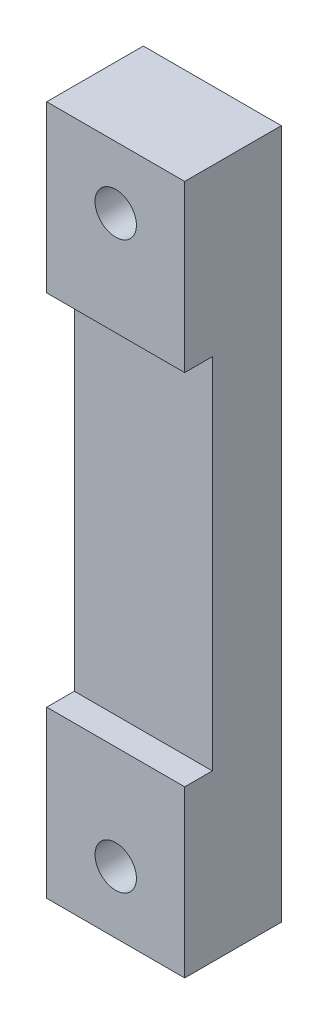
ISO-10303-21;
HEADER;
FILE_DESCRIPTION(('STEP AP214'),'2;1');
FILE_NAME('part.step','',(''),(''),'','','');
FILE_SCHEMA(('AUTOMOTIVE_DESIGN { 1 0 10303 214 1 1 1 1 }'));
ENDSEC;
DATA;
#1=APPLICATION_CONTEXT('core data for automotive mechanical design processes');
#2=APPLICATION_PROTOCOL_DEFINITION('international standard','automotive_design',2000,#1);
#3=PRODUCT_CONTEXT('',#1,'mechanical');
#4=PRODUCT('Part','Part','',(#3));
#5=PRODUCT_RELATED_PRODUCT_CATEGORY('part','',(#4));
#6=PRODUCT_DEFINITION_FORMATION('','',#4);
#7=PRODUCT_DEFINITION_CONTEXT('part definition',#1,'design');
#8=PRODUCT_DEFINITION('design','',#6,#7);
#9=PRODUCT_DEFINITION_SHAPE('','',#8);
#10=(LENGTH_UNIT() NAMED_UNIT(*) SI_UNIT(.MILLI.,.METRE.));
#11=(NAMED_UNIT(*) PLANE_ANGLE_UNIT() SI_UNIT($,.RADIAN.));
#12=(NAMED_UNIT(*) SI_UNIT($,.STERADIAN.) SOLID_ANGLE_UNIT());
#13=UNCERTAINTY_MEASURE_WITH_UNIT(LENGTH_MEASURE(1.E-05),#10,'distance_accuracy_value','');
#14=(GEOMETRIC_REPRESENTATION_CONTEXT(3) GLOBAL_UNCERTAINTY_ASSIGNED_CONTEXT((#13)) GLOBAL_UNIT_ASSIGNED_CONTEXT((#10,
#11,#12)) REPRESENTATION_CONTEXT('',''));
#15=CARTESIAN_POINT('',(0.,0.,0.));
#16=DIRECTION('',(0.,0.,1.));
#17=DIRECTION('',(1.,0.,0.));
#18=AXIS2_PLACEMENT_3D('',#15,#16,#17);
#19=CARTESIAN_POINT('',(0.,0.,5.));
#20=DIRECTION('',(0.,0.,1.));
#21=DIRECTION('',(1.,0.,0.));
#22=AXIS2_PLACEMENT_3D('',#19,#20,#21);
#23=PLANE('',#22);
#24=DIRECTION('',(0.,-1.,0.));
#25=VECTOR('',#24,1.);
#26=CARTESIAN_POINT('',(-23.9612775556175,25.7995619979399,5.));
#27=LINE('',#26,#25);
#28=CARTESIAN_POINT('',(-23.9612775556175,13.7995619979399,5.));
#29=VERTEX_POINT('',#28);
#30=CARTESIAN_POINT('',(-23.9612775556175,-12.2004380020601,5.));
#31=VERTEX_POINT('',#30);
#32=EDGE_CURVE('E48',#29,#31,#27,.T.);
#33=ORIENTED_EDGE('',*,*,#32,.T.);
#34=DIRECTION('',(-1.,0.,0.));
#35=VECTOR('',#34,1.);
#36=CARTESIAN_POINT('',(-13.9612775556175,-12.2004380020601,5.));
#37=LINE('',#36,#35);
#38=CARTESIAN_POINT('',(-13.9612775556175,-12.2004380020601,5.));
#39=VERTEX_POINT('',#38);
#40=EDGE_CURVE('E116',#39,#31,#37,.T.);
#41=ORIENTED_EDGE('',*,*,#40,.F.);
#42=DIRECTION('',(0.,1.,0.));
#43=VECTOR('',#42,1.);
#44=CARTESIAN_POINT('',(-13.9612775556175,-24.2004380020601,5.));
#45=LINE('',#44,#43);
#46=CARTESIAN_POINT('',(-13.9612775556175,13.7995619979399,5.));
#47=VERTEX_POINT('',#46);
#48=EDGE_CURVE('E144',#39,#47,#45,.T.);
#49=ORIENTED_EDGE('',*,*,#48,.T.);
#50=DIRECTION('',(1.,0.,0.));
#51=VECTOR('',#50,1.);
#52=CARTESIAN_POINT('',(-13.9612775556175,13.7995619979399,5.));
#53=LINE('',#52,#51);
#54=EDGE_CURVE('E53',#29,#47,#53,.T.);
#55=ORIENTED_EDGE('',*,*,#54,.F.);
#56=EDGE_LOOP('',(#33,#41,#49,#55));
#57=FACE_BOUND('',#56,.T.);
#58=ADVANCED_FACE('F33',(#57),#23,.T.);
#59=CARTESIAN_POINT('',(-13.9612775556175,25.7995619979399,5.));
#60=DIRECTION('',(0.,-1.,0.));
#61=DIRECTION('',(1.,0.,0.));
#62=AXIS2_PLACEMENT_3D('',#59,#60,#61);
#63=PLANE('',#62);
#64=DIRECTION('',(-1.,0.,0.));
#65=VECTOR('',#64,1.);
#66=CARTESIAN_POINT('',(-13.9612775556175,25.7995619979399,0.));
#67=LINE('',#66,#65);
#68=CARTESIAN_POINT('',(-13.9612775556175,25.7995619979399,0.));
#69=VERTEX_POINT('',#68);
#70=CARTESIAN_POINT('',(-23.9612775556175,25.7995619979399,0.));
#71=VERTEX_POINT('',#70);
#72=EDGE_CURVE('E142',#69,#71,#67,.T.);
#73=ORIENTED_EDGE('',*,*,#72,.T.);
#74=DIRECTION('',(0.,0.,-1.));
#75=VECTOR('',#74,1.);
#76=CARTESIAN_POINT('',(-23.9612775556175,25.7995619979399,5.));
#77=LINE('',#76,#75);
#78=CARTESIAN_POINT('',(-23.9612775556175,25.7995619979399,7.));
#79=VERTEX_POINT('',#78);
#80=EDGE_CURVE('E11',#79,#71,#77,.T.);
#81=ORIENTED_EDGE('',*,*,#80,.F.);
#82=DIRECTION('',(-1.,0.,0.));
#83=VECTOR('',#82,1.);
#84=CARTESIAN_POINT('',(-23.9612775556175,25.7995619979399,7.));
#85=LINE('',#84,#83);
#86=CARTESIAN_POINT('',(-13.9612775556175,25.7995619979399,7.));
#87=VERTEX_POINT('',#86);
#88=EDGE_CURVE('E133',#87,#79,#85,.T.);
#89=ORIENTED_EDGE('',*,*,#88,.F.);
#90=DIRECTION('',(0.,0.,-1.));
#91=VECTOR('',#90,1.);
#92=CARTESIAN_POINT('',(-13.9612775556175,25.7995619979399,5.));
#93=LINE('',#92,#91);
#94=EDGE_CURVE('E147',#87,#69,#93,.T.);
#95=ORIENTED_EDGE('',*,*,#94,.T.);
#96=EDGE_LOOP('',(#73,#81,#89,#95));
#97=FACE_BOUND('',#96,.T.);
#98=ADVANCED_FACE('F35',(#97),#63,.F.);
#99=CARTESIAN_POINT('',(-23.9612775556175,25.7995619979399,5.));
#100=DIRECTION('',(1.,0.,0.));
#101=DIRECTION('',(0.,1.,0.));
#102=AXIS2_PLACEMENT_3D('',#99,#100,#101);
#103=PLANE('',#102);
#104=DIRECTION('',(0.,-1.,0.));
#105=VECTOR('',#104,1.);
#106=CARTESIAN_POINT('',(-23.9612775556175,25.7995619979399,0.));
#107=LINE('',#106,#105);
#108=CARTESIAN_POINT('',(-23.9612775556175,-24.2004380020601,0.));
#109=VERTEX_POINT('',#108);
#110=EDGE_CURVE('E150',#71,#109,#107,.T.);
#111=ORIENTED_EDGE('',*,*,#110,.T.);
#112=DIRECTION('',(0.,0.,-1.));
#113=VECTOR('',#112,1.);
#114=CARTESIAN_POINT('',(-23.9612775556175,-24.2004380020601,5.));
#115=LINE('',#114,#113);
#116=CARTESIAN_POINT('',(-23.9612775556175,-24.2004380020601,7.));
#117=VERTEX_POINT('',#116);
#118=EDGE_CURVE('E41',#117,#109,#115,.T.);
#119=ORIENTED_EDGE('',*,*,#118,.F.);
#120=DIRECTION('',(0.,-1.,0.));
#121=VECTOR('',#120,1.);
#122=CARTESIAN_POINT('',(-23.9612775556175,-12.2004380020601,7.));
#123=LINE('',#122,#121);
#124=CARTESIAN_POINT('',(-23.9612775556175,-12.2004380020601,7.));
#125=VERTEX_POINT('',#124);
#126=EDGE_CURVE('E96',#125,#117,#123,.T.);
#127=ORIENTED_EDGE('',*,*,#126,.F.);
#128=DIRECTION('',(0.,0.,-1.));
#129=VECTOR('',#128,1.);
#130=CARTESIAN_POINT('',(-23.9612775556175,-12.2004380020601,7.));
#131=LINE('',#130,#129);
#132=EDGE_CURVE('E100',#125,#31,#131,.T.);
#133=ORIENTED_EDGE('',*,*,#132,.T.);
#134=ORIENTED_EDGE('',*,*,#32,.F.);
#135=DIRECTION('',(0.,0.,-1.));
#136=VECTOR('',#135,1.);
#137=CARTESIAN_POINT('',(-23.9612775556175,13.7995619979399,7.));
#138=LINE('',#137,#136);
#139=CARTESIAN_POINT('',(-23.9612775556175,13.7995619979399,7.));
#140=VERTEX_POINT('',#139);
#141=EDGE_CURVE('E139',#140,#29,#138,.T.);
#142=ORIENTED_EDGE('',*,*,#141,.F.);
#143=DIRECTION('',(0.,-1.,0.));
#144=VECTOR('',#143,1.);
#145=CARTESIAN_POINT('',(-23.9612775556175,13.7995619979399,7.));
#146=LINE('',#145,#144);
#147=EDGE_CURVE('E121',#79,#140,#146,.T.);
#148=ORIENTED_EDGE('',*,*,#147,.F.);
#149=ORIENTED_EDGE('',*,*,#80,.T.);
#150=EDGE_LOOP('',(#111,#119,#127,#133,#134,#142,#148,#149));
#151=FACE_BOUND('',#150,.T.);
#152=ADVANCED_FACE('F98',(#151),#103,.F.);
#153=CARTESIAN_POINT('',(-23.9612775556175,-24.2004380020601,5.));
#154=DIRECTION('',(0.,1.,0.));
#155=DIRECTION('',(0.,0.,1.));
#156=AXIS2_PLACEMENT_3D('',#153,#154,#155);
#157=PLANE('',#156);
#158=DIRECTION('',(1.,0.,0.));
#159=VECTOR('',#158,1.);
#160=CARTESIAN_POINT('',(-23.9612775556175,-24.2004380020601,0.));
#161=LINE('',#160,#159);
#162=CARTESIAN_POINT('',(-13.9612775556175,-24.2004380020601,0.));
#163=VERTEX_POINT('',#162);
#164=EDGE_CURVE('E152',#109,#163,#161,.T.);
#165=ORIENTED_EDGE('',*,*,#164,.T.);
#166=DIRECTION('',(0.,0.,-1.));
#167=VECTOR('',#166,1.);
#168=CARTESIAN_POINT('',(-13.9612775556175,-24.2004380020601,5.));
#169=LINE('',#168,#167);
#170=CARTESIAN_POINT('',(-13.9612775556175,-24.2004380020601,7.));
#171=VERTEX_POINT('',#170);
#172=EDGE_CURVE('E157',#171,#163,#169,.T.);
#173=ORIENTED_EDGE('',*,*,#172,.F.);
#174=DIRECTION('',(1.,0.,0.));
#175=VECTOR('',#174,1.);
#176=CARTESIAN_POINT('',(-23.9612775556175,-24.2004380020601,7.));
#177=LINE('',#176,#175);
#178=EDGE_CURVE('E106',#117,#171,#177,.T.);
#179=ORIENTED_EDGE('',*,*,#178,.F.);
#180=ORIENTED_EDGE('',*,*,#118,.T.);
#181=EDGE_LOOP('',(#165,#173,#179,#180));
#182=FACE_BOUND('',#181,.T.);
#183=ADVANCED_FACE('F161',(#182),#157,.F.);
#184=CARTESIAN_POINT('',(-13.9612775556175,-24.2004380020601,5.));
#185=DIRECTION('',(-1.,0.,0.));
#186=DIRECTION('',(0.,0.,1.));
#187=AXIS2_PLACEMENT_3D('',#184,#185,#186);
#188=PLANE('',#187);
#189=DIRECTION('',(0.,1.,0.));
#190=VECTOR('',#189,1.);
#191=CARTESIAN_POINT('',(-13.9612775556175,-24.2004380020601,0.));
#192=LINE('',#191,#190);
#193=EDGE_CURVE('E145',#163,#69,#192,.T.);
#194=ORIENTED_EDGE('',*,*,#193,.T.);
#195=ORIENTED_EDGE('',*,*,#94,.F.);
#196=DIRECTION('',(0.,1.,0.));
#197=VECTOR('',#196,1.);
#198=CARTESIAN_POINT('',(-13.9612775556175,25.7995619979399,7.));
#199=LINE('',#198,#197);
#200=CARTESIAN_POINT('',(-13.9612775556175,13.7995619979399,7.));
#201=VERTEX_POINT('',#200);
#202=EDGE_CURVE('E130',#201,#87,#199,.T.);
#203=ORIENTED_EDGE('',*,*,#202,.F.);
#204=DIRECTION('',(0.,0.,-1.));
#205=VECTOR('',#204,1.);
#206=CARTESIAN_POINT('',(-13.9612775556175,13.7995619979399,7.));
#207=LINE('',#206,#205);
#208=EDGE_CURVE('E135',#201,#47,#207,.T.);
#209=ORIENTED_EDGE('',*,*,#208,.T.);
#210=ORIENTED_EDGE('',*,*,#48,.F.);
#211=DIRECTION('',(0.,0.,-1.));
#212=VECTOR('',#211,1.);
#213=CARTESIAN_POINT('',(-13.9612775556175,-12.2004380020601,7.));
#214=LINE('',#213,#212);
#215=CARTESIAN_POINT('',(-13.9612775556175,-12.2004380020601,7.));
#216=VERTEX_POINT('',#215);
#217=EDGE_CURVE('E119',#216,#39,#214,.T.);
#218=ORIENTED_EDGE('',*,*,#217,.F.);
#219=DIRECTION('',(0.,1.,0.));
#220=VECTOR('',#219,1.);
#221=CARTESIAN_POINT('',(-13.9612775556175,-24.2004380020601,7.));
#222=LINE('',#221,#220);
#223=EDGE_CURVE('E112',#171,#216,#222,.T.);
#224=ORIENTED_EDGE('',*,*,#223,.F.);
#225=ORIENTED_EDGE('',*,*,#172,.T.);
#226=EDGE_LOOP('',(#194,#195,#203,#209,#210,#218,#224,#225));
#227=FACE_BOUND('',#226,.T.);
#228=ADVANCED_FACE('F167',(#227),#188,.F.);
#229=CARTESIAN_POINT('',(0.,0.,0.));
#230=DIRECTION('',(0.,0.,1.));
#231=DIRECTION('',(1.,0.,0.));
#232=AXIS2_PLACEMENT_3D('',#229,#230,#231);
#233=PLANE('',#232);
#234=CARTESIAN_POINT('',(-18.9612775556175,21.2995619979399,0.));
#235=DIRECTION('',(0.,0.,1.));
#236=DIRECTION('',(1.,0.,0.));
#237=AXIS2_PLACEMENT_3D('',#234,#235,#236);
#238=CIRCLE('',#237,1.5);
#239=CARTESIAN_POINT('',(-17.4612775556175,21.2995619979399,0.));
#240=VERTEX_POINT('',#239);
#241=EDGE_CURVE('E187',#240,#240,#238,.T.);
#242=ORIENTED_EDGE('',*,*,#241,.T.);
#243=EDGE_LOOP('',(#242));
#244=FACE_BOUND('',#243,.T.);
#245=CARTESIAN_POINT('',(-18.9612775556175,-19.7004380020601,0.));
#246=DIRECTION('',(0.,0.,1.));
#247=DIRECTION('',(1.,0.,0.));
#248=AXIS2_PLACEMENT_3D('',#245,#246,#247);
#249=CIRCLE('',#248,1.5);
#250=CARTESIAN_POINT('',(-17.4612775556175,-19.7004380020601,0.));
#251=VERTEX_POINT('',#250);
#252=EDGE_CURVE('E178',#251,#251,#249,.T.);
#253=ORIENTED_EDGE('',*,*,#252,.T.);
#254=EDGE_LOOP('',(#253));
#255=FACE_BOUND('',#254,.T.);
#256=ORIENTED_EDGE('',*,*,#72,.F.);
#257=ORIENTED_EDGE('',*,*,#193,.F.);
#258=ORIENTED_EDGE('',*,*,#164,.F.);
#259=ORIENTED_EDGE('',*,*,#110,.F.);
#260=EDGE_LOOP('',(#256,#257,#258,#259));
#261=FACE_BOUND('',#260,.T.);
#262=ADVANCED_FACE('F165',(#244,#255,#261),#233,.F.);
#263=CARTESIAN_POINT('',(-13.9612775556175,13.7995619979399,7.));
#264=DIRECTION('',(0.,1.,0.));
#265=DIRECTION('',(-1.,0.,0.));
#266=AXIS2_PLACEMENT_3D('',#263,#264,#265);
#267=PLANE('',#266);
#268=ORIENTED_EDGE('',*,*,#54,.T.);
#269=ORIENTED_EDGE('',*,*,#208,.F.);
#270=DIRECTION('',(1.,0.,0.));
#271=VECTOR('',#270,1.);
#272=CARTESIAN_POINT('',(-13.9612775556175,13.7995619979399,7.));
#273=LINE('',#272,#271);
#274=EDGE_CURVE('E128',#140,#201,#273,.T.);
#275=ORIENTED_EDGE('',*,*,#274,.F.);
#276=ORIENTED_EDGE('',*,*,#141,.T.);
#277=EDGE_LOOP('',(#268,#269,#275,#276));
#278=FACE_BOUND('',#277,.T.);
#279=ADVANCED_FACE('F176',(#278),#267,.F.);
#280=CARTESIAN_POINT('',(0.,0.,7.));
#281=DIRECTION('',(0.,0.,-1.));
#282=DIRECTION('',(-1.,0.,0.));
#283=AXIS2_PLACEMENT_3D('',#280,#281,#282);
#284=PLANE('',#283);
#285=CARTESIAN_POINT('',(-18.9612775556175,21.2995619979399,7.));
#286=DIRECTION('',(0.,0.,1.));
#287=DIRECTION('',(1.,0.,0.));
#288=AXIS2_PLACEMENT_3D('',#285,#286,#287);
#289=CIRCLE('',#288,1.5);
#290=CARTESIAN_POINT('',(-17.4612775556175,21.2995619979399,7.));
#291=VERTEX_POINT('',#290);
#292=EDGE_CURVE('E190',#291,#291,#289,.T.);
#293=ORIENTED_EDGE('',*,*,#292,.F.);
#294=EDGE_LOOP('',(#293));
#295=FACE_BOUND('',#294,.T.);
#296=ORIENTED_EDGE('',*,*,#147,.T.);
#297=ORIENTED_EDGE('',*,*,#274,.T.);
#298=ORIENTED_EDGE('',*,*,#202,.T.);
#299=ORIENTED_EDGE('',*,*,#88,.T.);
#300=EDGE_LOOP('',(#296,#297,#298,#299));
#301=FACE_BOUND('',#300,.T.);
#302=ADVANCED_FACE('F173',(#295,#301),#284,.F.);
#303=CARTESIAN_POINT('',(-13.9612775556175,-12.2004380020601,7.));
#304=DIRECTION('',(0.,-1.,0.));
#305=DIRECTION('',(1.,0.,0.));
#306=AXIS2_PLACEMENT_3D('',#303,#304,#305);
#307=PLANE('',#306);
#308=ORIENTED_EDGE('',*,*,#40,.T.);
#309=ORIENTED_EDGE('',*,*,#132,.F.);
#310=DIRECTION('',(-1.,0.,0.));
#311=VECTOR('',#310,1.);
#312=CARTESIAN_POINT('',(-13.9612775556175,-12.2004380020601,7.));
#313=LINE('',#312,#311);
#314=EDGE_CURVE('E107',#216,#125,#313,.T.);
#315=ORIENTED_EDGE('',*,*,#314,.F.);
#316=ORIENTED_EDGE('',*,*,#217,.T.);
#317=EDGE_LOOP('',(#308,#309,#315,#316));
#318=FACE_BOUND('',#317,.T.);
#319=ADVANCED_FACE('F118',(#318),#307,.F.);
#320=CARTESIAN_POINT('',(0.,0.,7.));
#321=DIRECTION('',(0.,0.,1.));
#322=DIRECTION('',(1.,0.,0.));
#323=AXIS2_PLACEMENT_3D('',#320,#321,#322);
#324=PLANE('',#323);
#325=CARTESIAN_POINT('',(-18.9612775556175,-19.7004380020601,7.));
#326=DIRECTION('',(0.,0.,1.));
#327=DIRECTION('',(1.,0.,0.));
#328=AXIS2_PLACEMENT_3D('',#325,#326,#327);
#329=CIRCLE('',#328,1.5);
#330=CARTESIAN_POINT('',(-17.4612775556175,-19.7004380020601,7.));
#331=VERTEX_POINT('',#330);
#332=EDGE_CURVE('E180',#331,#331,#329,.T.);
#333=ORIENTED_EDGE('',*,*,#332,.F.);
#334=EDGE_LOOP('',(#333));
#335=FACE_BOUND('',#334,.T.);
#336=ORIENTED_EDGE('',*,*,#314,.T.);
#337=ORIENTED_EDGE('',*,*,#126,.T.);
#338=ORIENTED_EDGE('',*,*,#178,.T.);
#339=ORIENTED_EDGE('',*,*,#223,.T.);
#340=EDGE_LOOP('',(#336,#337,#338,#339));
#341=FACE_BOUND('',#340,.T.);
#342=ADVANCED_FACE('F110',(#335,#341),#324,.T.);
#343=CARTESIAN_POINT('',(-18.9612775556175,-19.7004380020601,-16.0738998847055));
#344=DIRECTION('',(0.,0.,1.));
#345=DIRECTION('',(1.,0.,0.));
#346=AXIS2_PLACEMENT_3D('',#343,#344,#345);
#347=CYLINDRICAL_SURFACE('',#346,1.5);
#348=ORIENTED_EDGE('',*,*,#332,.T.);
#349=EDGE_LOOP('',(#348));
#350=FACE_BOUND('',#349,.T.);
#351=ORIENTED_EDGE('',*,*,#252,.F.);
#352=EDGE_LOOP('',(#351));
#353=FACE_BOUND('',#352,.T.);
#354=ADVANCED_FACE('F280',(#350,#353),#347,.F.);
#355=CARTESIAN_POINT('',(-18.9612775556175,21.2995619979399,-16.0738998847055));
#356=DIRECTION('',(0.,0.,1.));
#357=DIRECTION('',(1.,0.,0.));
#358=AXIS2_PLACEMENT_3D('',#355,#356,#357);
#359=CYLINDRICAL_SURFACE('',#358,1.5);
#360=ORIENTED_EDGE('',*,*,#292,.T.);
#361=EDGE_LOOP('',(#360));
#362=FACE_BOUND('',#361,.T.);
#363=ORIENTED_EDGE('',*,*,#241,.F.);
#364=EDGE_LOOP('',(#363));
#365=FACE_BOUND('',#364,.T.);
#366=ADVANCED_FACE('F194',(#362,#365),#359,.F.);
#367=CLOSED_SHELL('',(#58,#98,#152,#183,#228,#262,#279,#302,#319,#342,#354,#366));
#368=MANIFOLD_SOLID_BREP('B2',#367);
#369=ADVANCED_BREP_SHAPE_REPRESENTATION('',(#18,#368),#14);
#370=SHAPE_DEFINITION_REPRESENTATION(#9,#369);
ENDSEC;
END-ISO-10303-21;
